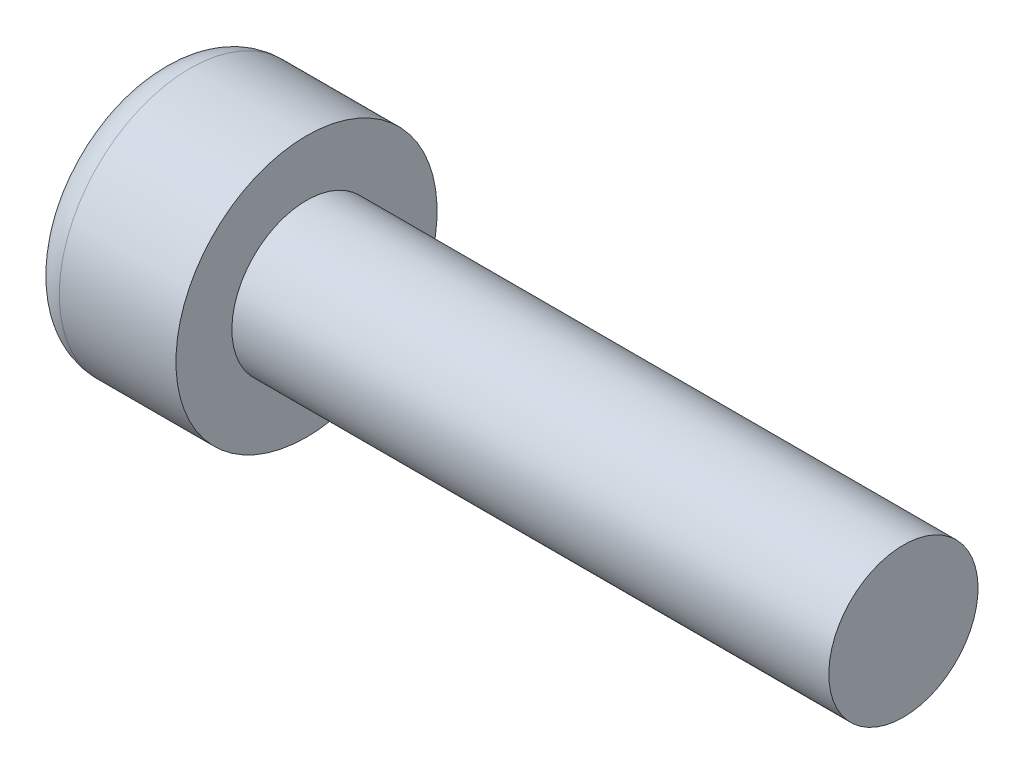
ISO-10303-21;
HEADER;
FILE_DESCRIPTION(('STEP AP214'),'2;1');
FILE_NAME('part.step','',(''),(''),'','','');
FILE_SCHEMA(('AUTOMOTIVE_DESIGN { 1 0 10303 214 1 1 1 1 }'));
ENDSEC;
DATA;
#1=APPLICATION_CONTEXT('core data for automotive mechanical design processes');
#2=APPLICATION_PROTOCOL_DEFINITION('international standard','automotive_design',2000,#1);
#3=PRODUCT_CONTEXT('',#1,'mechanical');
#4=PRODUCT('Part','Part','',(#3));
#5=PRODUCT_RELATED_PRODUCT_CATEGORY('part','',(#4));
#6=PRODUCT_DEFINITION_FORMATION('','',#4);
#7=PRODUCT_DEFINITION_CONTEXT('part definition',#1,'design');
#8=PRODUCT_DEFINITION('design','',#6,#7);
#9=PRODUCT_DEFINITION_SHAPE('','',#8);
#10=(LENGTH_UNIT() NAMED_UNIT(*) SI_UNIT(.MILLI.,.METRE.));
#11=(NAMED_UNIT(*) PLANE_ANGLE_UNIT() SI_UNIT($,.RADIAN.));
#12=(NAMED_UNIT(*) SI_UNIT($,.STERADIAN.) SOLID_ANGLE_UNIT());
#13=UNCERTAINTY_MEASURE_WITH_UNIT(LENGTH_MEASURE(1.E-05),#10,'distance_accuracy_value','');
#14=(GEOMETRIC_REPRESENTATION_CONTEXT(3) GLOBAL_UNCERTAINTY_ASSIGNED_CONTEXT((#13)) GLOBAL_UNIT_ASSIGNED_CONTEXT((#10,
#11,#12)) REPRESENTATION_CONTEXT('',''));
#15=CARTESIAN_POINT('',(0.,0.,0.));
#16=DIRECTION('',(0.,0.,1.));
#17=DIRECTION('',(1.,0.,0.));
#18=AXIS2_PLACEMENT_3D('',#15,#16,#17);
#19=CARTESIAN_POINT('',(0.,0.,0.));
#20=DIRECTION('',(1.,0.,0.));
#21=DIRECTION('',(0.,1.,0.));
#22=AXIS2_PLACEMENT_3D('',#19,#20,#21);
#23=PLANE('',#22);
#24=DIRECTION('',(0.,-0.5,-0.866025403784439));
#25=VECTOR('',#24,1.);
#26=CARTESIAN_POINT('',(0.,1.73205080756888,0.));
#27=LINE('',#26,#25);
#28=CARTESIAN_POINT('',(0.,1.73205080756888,0.));
#29=VERTEX_POINT('',#28);
#30=CARTESIAN_POINT('',(0.,0.866025403784439,-1.5));
#31=VERTEX_POINT('',#30);
#32=EDGE_CURVE('E121',#29,#31,#27,.T.);
#33=ORIENTED_EDGE('',*,*,#32,.F.);
#34=DIRECTION('',(0.,0.5,-0.866025403784439));
#35=VECTOR('',#34,1.);
#36=CARTESIAN_POINT('',(0.,0.866025403784439,1.5));
#37=LINE('',#36,#35);
#38=CARTESIAN_POINT('',(0.,0.866025403784439,1.5));
#39=VERTEX_POINT('',#38);
#40=EDGE_CURVE('E47',#39,#29,#37,.T.);
#41=ORIENTED_EDGE('',*,*,#40,.F.);
#42=DIRECTION('',(0.,1.,0.));
#43=VECTOR('',#42,1.);
#44=CARTESIAN_POINT('',(0.,-0.866025403784439,1.5));
#45=LINE('',#44,#43);
#46=CARTESIAN_POINT('',(0.,-0.866025403784439,1.5));
#47=VERTEX_POINT('',#46);
#48=EDGE_CURVE('E130',#47,#39,#45,.T.);
#49=ORIENTED_EDGE('',*,*,#48,.F.);
#50=DIRECTION('',(0.,0.5,0.866025403784439));
#51=VECTOR('',#50,1.);
#52=CARTESIAN_POINT('',(0.,-1.73205080756888,0.));
#53=LINE('',#52,#51);
#54=CARTESIAN_POINT('',(0.,-1.73205080756888,0.));
#55=VERTEX_POINT('',#54);
#56=EDGE_CURVE('E128',#55,#47,#53,.T.);
#57=ORIENTED_EDGE('',*,*,#56,.F.);
#58=DIRECTION('',(0.,-0.5,0.866025403784439));
#59=VECTOR('',#58,1.);
#60=CARTESIAN_POINT('',(0.,-0.866025403784439,-1.5));
#61=LINE('',#60,#59);
#62=CARTESIAN_POINT('',(0.,-0.866025403784439,-1.5));
#63=VERTEX_POINT('',#62);
#64=EDGE_CURVE('E95',#63,#55,#61,.T.);
#65=ORIENTED_EDGE('',*,*,#64,.F.);
#66=DIRECTION('',(0.,-1.,0.));
#67=VECTOR('',#66,1.);
#68=CARTESIAN_POINT('',(0.,0.866025403784439,-1.5));
#69=LINE('',#68,#67);
#70=EDGE_CURVE('E124',#31,#63,#69,.T.);
#71=ORIENTED_EDGE('',*,*,#70,.F.);
#72=EDGE_LOOP('',(#33,#41,#49,#57,#65,#71));
#73=FACE_BOUND('',#72,.T.);
#74=CARTESIAN_POINT('',(0.,0.,0.));
#75=DIRECTION('',(-1.,0.,0.));
#76=DIRECTION('',(0.,-1.,0.));
#77=AXIS2_PLACEMENT_3D('',#74,#75,#76);
#78=CIRCLE('',#77,2.625);
#79=CARTESIAN_POINT('',(0.,-2.625,0.));
#80=VERTEX_POINT('',#79);
#81=EDGE_CURVE('E11',#80,#80,#78,.T.);
#82=ORIENTED_EDGE('',*,*,#81,.T.);
#83=EDGE_LOOP('',(#82));
#84=FACE_BOUND('',#83,.T.);
#85=ADVANCED_FACE('F33',(#73,#84),#23,.F.);
#86=CARTESIAN_POINT('',(0.875,0.,0.));
#87=DIRECTION('',(-1.,0.,0.));
#88=DIRECTION('',(0.,-1.,0.));
#89=AXIS2_PLACEMENT_3D('',#86,#87,#88);
#90=TOROIDAL_SURFACE('',#89,2.625,0.875);
#91=ORIENTED_EDGE('',*,*,#81,.F.);
#92=EDGE_LOOP('',(#91));
#93=FACE_BOUND('',#92,.T.);
#94=CARTESIAN_POINT('',(0.875,0.,0.));
#95=DIRECTION('',(-1.,0.,0.));
#96=DIRECTION('',(0.,-1.,0.));
#97=AXIS2_PLACEMENT_3D('',#94,#95,#96);
#98=CIRCLE('',#97,3.5);
#99=CARTESIAN_POINT('',(0.875000000000001,-3.5,0.));
#100=VERTEX_POINT('',#99);
#101=EDGE_CURVE('E40',#100,#100,#98,.T.);
#102=ORIENTED_EDGE('',*,*,#101,.T.);
#103=EDGE_LOOP('',(#102));
#104=FACE_BOUND('',#103,.T.);
#105=ADVANCED_FACE('F150',(#93,#104),#90,.T.);
#106=CARTESIAN_POINT('',(0.,0.,0.));
#107=DIRECTION('',(-1.,0.,0.));
#108=DIRECTION('',(0.,-1.,0.));
#109=AXIS2_PLACEMENT_3D('',#106,#107,#108);
#110=CYLINDRICAL_SURFACE('',#109,3.5);
#111=ORIENTED_EDGE('',*,*,#101,.F.);
#112=EDGE_LOOP('',(#111));
#113=FACE_BOUND('',#112,.T.);
#114=CARTESIAN_POINT('',(4.,0.,0.));
#115=DIRECTION('',(-1.,0.,0.));
#116=DIRECTION('',(0.,-1.,0.));
#117=AXIS2_PLACEMENT_3D('',#114,#115,#116);
#118=CIRCLE('',#117,3.5);
#119=CARTESIAN_POINT('',(4.,-3.5,0.));
#120=VERTEX_POINT('',#119);
#121=EDGE_CURVE('E145',#120,#120,#118,.T.);
#122=ORIENTED_EDGE('',*,*,#121,.T.);
#123=EDGE_LOOP('',(#122));
#124=FACE_BOUND('',#123,.T.);
#125=ADVANCED_FACE('F152',(#113,#124),#110,.T.);
#126=CARTESIAN_POINT('',(4.,3.5,0.));
#127=DIRECTION('',(-1.,0.,0.));
#128=DIRECTION('',(0.,-1.,0.));
#129=AXIS2_PLACEMENT_3D('',#126,#127,#128);
#130=PLANE('',#129);
#131=ORIENTED_EDGE('',*,*,#121,.F.);
#132=EDGE_LOOP('',(#131));
#133=FACE_BOUND('',#132,.T.);
#134=CARTESIAN_POINT('',(4.,0.,0.));
#135=DIRECTION('',(-1.,0.,0.));
#136=DIRECTION('',(0.,-1.,0.));
#137=AXIS2_PLACEMENT_3D('',#134,#135,#136);
#138=CIRCLE('',#137,2.);
#139=CARTESIAN_POINT('',(4.,-2.,0.));
#140=VERTEX_POINT('',#139);
#141=EDGE_CURVE('E142',#140,#140,#138,.T.);
#142=ORIENTED_EDGE('',*,*,#141,.T.);
#143=EDGE_LOOP('',(#142));
#144=FACE_BOUND('',#143,.T.);
#145=ADVANCED_FACE('F155',(#133,#144),#130,.F.);
#146=CARTESIAN_POINT('',(0.,0.,0.));
#147=DIRECTION('',(-1.,0.,0.));
#148=DIRECTION('',(0.,-1.,0.));
#149=AXIS2_PLACEMENT_3D('',#146,#147,#148);
#150=CYLINDRICAL_SURFACE('',#149,2.);
#151=ORIENTED_EDGE('',*,*,#141,.F.);
#152=EDGE_LOOP('',(#151));
#153=FACE_BOUND('',#152,.T.);
#154=CARTESIAN_POINT('',(20.,0.,0.));
#155=DIRECTION('',(-1.,0.,0.));
#156=DIRECTION('',(0.,-1.,0.));
#157=AXIS2_PLACEMENT_3D('',#154,#155,#156);
#158=CIRCLE('',#157,2.);
#159=CARTESIAN_POINT('',(20.,-1.99999999999999,0.));
#160=VERTEX_POINT('',#159);
#161=EDGE_CURVE('E134',#160,#160,#158,.T.);
#162=ORIENTED_EDGE('',*,*,#161,.T.);
#163=EDGE_LOOP('',(#162));
#164=FACE_BOUND('',#163,.T.);
#165=ADVANCED_FACE('F161',(#153,#164),#150,.T.);
#166=CARTESIAN_POINT('',(20.,2.,0.));
#167=DIRECTION('',(-1.,0.,0.));
#168=DIRECTION('',(0.,-1.,0.));
#169=AXIS2_PLACEMENT_3D('',#166,#167,#168);
#170=PLANE('',#169);
#171=ORIENTED_EDGE('',*,*,#161,.F.);
#172=EDGE_LOOP('',(#171));
#173=FACE_BOUND('',#172,.T.);
#174=ADVANCED_FACE('F167',(#173),#170,.F.);
#175=CARTESIAN_POINT('',(2.,0.866025403784439,1.5));
#176=DIRECTION('',(0.,0.866025403784439,0.5));
#177=DIRECTION('',(0.,-0.5,0.866025403784439));
#178=AXIS2_PLACEMENT_3D('',#175,#176,#177);
#179=PLANE('',#178);
#180=ORIENTED_EDGE('',*,*,#40,.T.);
#181=DIRECTION('',(-1.,0.,0.));
#182=VECTOR('',#181,1.);
#183=CARTESIAN_POINT('',(2.,1.73205080756888,0.));
#184=LINE('',#183,#182);
#185=CARTESIAN_POINT('',(2.,1.73205080756888,0.));
#186=VERTEX_POINT('',#185);
#187=EDGE_CURVE('E77',#186,#29,#184,.T.);
#188=ORIENTED_EDGE('',*,*,#187,.F.);
#189=DIRECTION('',(0.,0.5,-0.866025403784439));
#190=VECTOR('',#189,1.);
#191=CARTESIAN_POINT('',(2.,0.866025403784439,1.5));
#192=LINE('',#191,#190);
#193=CARTESIAN_POINT('',(2.,0.866025403784439,1.5));
#194=VERTEX_POINT('',#193);
#195=EDGE_CURVE('E132',#194,#186,#192,.T.);
#196=ORIENTED_EDGE('',*,*,#195,.F.);
#197=DIRECTION('',(-1.,0.,0.));
#198=VECTOR('',#197,1.);
#199=CARTESIAN_POINT('',(2.,0.866025403784439,1.5));
#200=LINE('',#199,#198);
#201=EDGE_CURVE('E55',#194,#39,#200,.T.);
#202=ORIENTED_EDGE('',*,*,#201,.T.);
#203=EDGE_LOOP('',(#180,#188,#196,#202));
#204=FACE_BOUND('',#203,.T.);
#205=ADVANCED_FACE('F172',(#204),#179,.F.);
#206=CARTESIAN_POINT('',(2.,-0.866025403784439,1.5));
#207=DIRECTION('',(0.,0.,1.));
#208=DIRECTION('',(0.,-1.,0.));
#209=AXIS2_PLACEMENT_3D('',#206,#207,#208);
#210=PLANE('',#209);
#211=ORIENTED_EDGE('',*,*,#48,.T.);
#212=ORIENTED_EDGE('',*,*,#201,.F.);
#213=DIRECTION('',(0.,1.,0.));
#214=VECTOR('',#213,1.);
#215=CARTESIAN_POINT('',(2.,-0.866025403784439,1.5));
#216=LINE('',#215,#214);
#217=CARTESIAN_POINT('',(2.,-0.866025403784439,1.5));
#218=VERTEX_POINT('',#217);
#219=EDGE_CURVE('E107',#218,#194,#216,.T.);
#220=ORIENTED_EDGE('',*,*,#219,.F.);
#221=DIRECTION('',(-1.,0.,0.));
#222=VECTOR('',#221,1.);
#223=CARTESIAN_POINT('',(2.,-0.866025403784439,1.5));
#224=LINE('',#223,#222);
#225=EDGE_CURVE('E99',#218,#47,#224,.T.);
#226=ORIENTED_EDGE('',*,*,#225,.T.);
#227=EDGE_LOOP('',(#211,#212,#220,#226));
#228=FACE_BOUND('',#227,.T.);
#229=ADVANCED_FACE('F177',(#228),#210,.F.);
#230=CARTESIAN_POINT('',(2.,-1.73205080756888,0.));
#231=DIRECTION('',(0.,-0.866025403784439,0.5));
#232=DIRECTION('',(0.,-0.5,-0.866025403784439));
#233=AXIS2_PLACEMENT_3D('',#230,#231,#232);
#234=PLANE('',#233);
#235=ORIENTED_EDGE('',*,*,#56,.T.);
#236=ORIENTED_EDGE('',*,*,#225,.F.);
#237=DIRECTION('',(0.,0.5,0.866025403784439));
#238=VECTOR('',#237,1.);
#239=CARTESIAN_POINT('',(2.,-1.73205080756888,0.));
#240=LINE('',#239,#238);
#241=CARTESIAN_POINT('',(2.,-1.73205080756888,0.));
#242=VERTEX_POINT('',#241);
#243=EDGE_CURVE('E103',#242,#218,#240,.T.);
#244=ORIENTED_EDGE('',*,*,#243,.F.);
#245=DIRECTION('',(-1.,0.,0.));
#246=VECTOR('',#245,1.);
#247=CARTESIAN_POINT('',(2.,-1.73205080756888,0.));
#248=LINE('',#247,#246);
#249=EDGE_CURVE('E88',#242,#55,#248,.T.);
#250=ORIENTED_EDGE('',*,*,#249,.T.);
#251=EDGE_LOOP('',(#235,#236,#244,#250));
#252=FACE_BOUND('',#251,.T.);
#253=ADVANCED_FACE('F104',(#252),#234,.F.);
#254=CARTESIAN_POINT('',(2.,-0.866025403784439,-1.5));
#255=DIRECTION('',(0.,-0.866025403784439,-0.5));
#256=DIRECTION('',(0.,0.5,-0.866025403784439));
#257=AXIS2_PLACEMENT_3D('',#254,#255,#256);
#258=PLANE('',#257);
#259=ORIENTED_EDGE('',*,*,#64,.T.);
#260=ORIENTED_EDGE('',*,*,#249,.F.);
#261=DIRECTION('',(0.,-0.5,0.866025403784439));
#262=VECTOR('',#261,1.);
#263=CARTESIAN_POINT('',(2.,-0.866025403784439,-1.5));
#264=LINE('',#263,#262);
#265=CARTESIAN_POINT('',(2.,-0.866025403784439,-1.5));
#266=VERTEX_POINT('',#265);
#267=EDGE_CURVE('E92',#266,#242,#264,.T.);
#268=ORIENTED_EDGE('',*,*,#267,.F.);
#269=DIRECTION('',(-1.,0.,0.));
#270=VECTOR('',#269,1.);
#271=CARTESIAN_POINT('',(2.,-0.866025403784439,-1.5));
#272=LINE('',#271,#270);
#273=EDGE_CURVE('E100',#266,#63,#272,.T.);
#274=ORIENTED_EDGE('',*,*,#273,.T.);
#275=EDGE_LOOP('',(#259,#260,#268,#274));
#276=FACE_BOUND('',#275,.T.);
#277=ADVANCED_FACE('F90',(#276),#258,.F.);
#278=CARTESIAN_POINT('',(2.,0.866025403784439,-1.5));
#279=DIRECTION('',(0.,0.,-1.));
#280=DIRECTION('',(-1.,0.,0.));
#281=AXIS2_PLACEMENT_3D('',#278,#279,#280);
#282=PLANE('',#281);
#283=ORIENTED_EDGE('',*,*,#70,.T.);
#284=ORIENTED_EDGE('',*,*,#273,.F.);
#285=DIRECTION('',(0.,-1.,0.));
#286=VECTOR('',#285,1.);
#287=CARTESIAN_POINT('',(2.,0.866025403784439,-1.5));
#288=LINE('',#287,#286);
#289=CARTESIAN_POINT('',(2.,0.866025403784439,-1.5));
#290=VERTEX_POINT('',#289);
#291=EDGE_CURVE('E113',#290,#266,#288,.T.);
#292=ORIENTED_EDGE('',*,*,#291,.F.);
#293=DIRECTION('',(-1.,0.,0.));
#294=VECTOR('',#293,1.);
#295=CARTESIAN_POINT('',(2.,0.866025403784439,-1.5));
#296=LINE('',#295,#294);
#297=EDGE_CURVE('E137',#290,#31,#296,.T.);
#298=ORIENTED_EDGE('',*,*,#297,.T.);
#299=EDGE_LOOP('',(#283,#284,#292,#298));
#300=FACE_BOUND('',#299,.T.);
#301=ADVANCED_FACE('F203',(#300),#282,.F.);
#302=CARTESIAN_POINT('',(2.,1.73205080756888,0.));
#303=DIRECTION('',(0.,0.866025403784439,-0.5));
#304=DIRECTION('',(0.,0.5,0.866025403784439));
#305=AXIS2_PLACEMENT_3D('',#302,#303,#304);
#306=PLANE('',#305);
#307=ORIENTED_EDGE('',*,*,#32,.T.);
#308=ORIENTED_EDGE('',*,*,#297,.F.);
#309=DIRECTION('',(0.,-0.5,-0.866025403784439));
#310=VECTOR('',#309,1.);
#311=CARTESIAN_POINT('',(2.,1.73205080756888,0.));
#312=LINE('',#311,#310);
#313=EDGE_CURVE('E115',#186,#290,#312,.T.);
#314=ORIENTED_EDGE('',*,*,#313,.F.);
#315=ORIENTED_EDGE('',*,*,#187,.T.);
#316=EDGE_LOOP('',(#307,#308,#314,#315));
#317=FACE_BOUND('',#316,.T.);
#318=ADVANCED_FACE('F191',(#317),#306,.F.);
#319=CARTESIAN_POINT('',(2.,0.,0.));
#320=DIRECTION('',(-1.,0.,0.));
#321=DIRECTION('',(0.,-1.,0.));
#322=AXIS2_PLACEMENT_3D('',#319,#320,#321);
#323=PLANE('',#322);
#324=ORIENTED_EDGE('',*,*,#195,.T.);
#325=ORIENTED_EDGE('',*,*,#313,.T.);
#326=ORIENTED_EDGE('',*,*,#291,.T.);
#327=ORIENTED_EDGE('',*,*,#267,.T.);
#328=ORIENTED_EDGE('',*,*,#243,.T.);
#329=ORIENTED_EDGE('',*,*,#219,.T.);
#330=EDGE_LOOP('',(#324,#325,#326,#327,#328,#329));
#331=FACE_BOUND('',#330,.T.);
#332=ADVANCED_FACE('F110',(#331),#323,.T.);
#333=CLOSED_SHELL('',(#85,#105,#125,#145,#165,#174,#205,#229,#253,#277,#301,#318,#332));
#334=MANIFOLD_SOLID_BREP('B2',#333);
#335=ADVANCED_BREP_SHAPE_REPRESENTATION('',(#18,#334),#14);
#336=SHAPE_DEFINITION_REPRESENTATION(#9,#335);
ENDSEC;
END-ISO-10303-21;
